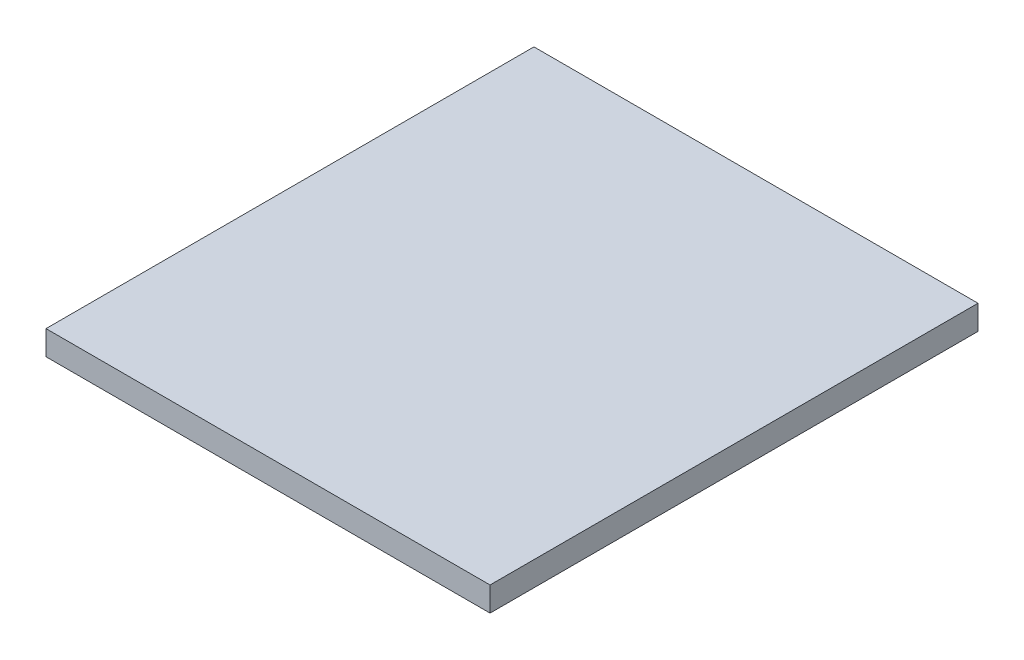
ISO-10303-21;
HEADER;
FILE_DESCRIPTION(('STEP AP214'),'2;1');
FILE_NAME('part.step','',(''),(''),'','','');
FILE_SCHEMA(('AUTOMOTIVE_DESIGN { 1 0 10303 214 1 1 1 1 }'));
ENDSEC;
DATA;
#1=APPLICATION_CONTEXT('core data for automotive mechanical design processes');
#2=APPLICATION_PROTOCOL_DEFINITION('international standard','automotive_design',2000,#1);
#3=PRODUCT_CONTEXT('',#1,'mechanical');
#4=PRODUCT('Part','Part','',(#3));
#5=PRODUCT_RELATED_PRODUCT_CATEGORY('part','',(#4));
#6=PRODUCT_DEFINITION_FORMATION('','',#4);
#7=PRODUCT_DEFINITION_CONTEXT('part definition',#1,'design');
#8=PRODUCT_DEFINITION('design','',#6,#7);
#9=PRODUCT_DEFINITION_SHAPE('','',#8);
#10=(LENGTH_UNIT() NAMED_UNIT(*) SI_UNIT(.MILLI.,.METRE.));
#11=(NAMED_UNIT(*) PLANE_ANGLE_UNIT() SI_UNIT($,.RADIAN.));
#12=(NAMED_UNIT(*) SI_UNIT($,.STERADIAN.) SOLID_ANGLE_UNIT());
#13=UNCERTAINTY_MEASURE_WITH_UNIT(LENGTH_MEASURE(1.E-05),#10,'distance_accuracy_value','');
#14=(GEOMETRIC_REPRESENTATION_CONTEXT(3) GLOBAL_UNCERTAINTY_ASSIGNED_CONTEXT((#13)) GLOBAL_UNIT_ASSIGNED_CONTEXT((#10,
#11,#12)) REPRESENTATION_CONTEXT('',''));
#15=CARTESIAN_POINT('',(0.,0.,0.));
#16=DIRECTION('',(0.,0.,1.));
#17=DIRECTION('',(1.,0.,0.));
#18=AXIS2_PLACEMENT_3D('',#15,#16,#17);
#19=CARTESIAN_POINT('',(-45.5,5.,-50.));
#20=DIRECTION('',(1.,0.,0.));
#21=DIRECTION('',(0.,0.,-1.));
#22=AXIS2_PLACEMENT_3D('',#19,#20,#21);
#23=PLANE('',#22);
#24=DIRECTION('',(0.,0.,1.));
#25=VECTOR('',#24,1.);
#26=CARTESIAN_POINT('',(-45.5,0.,-50.));
#27=LINE('',#26,#25);
#28=CARTESIAN_POINT('',(-45.5,0.,-50.));
#29=VERTEX_POINT('',#28);
#30=CARTESIAN_POINT('',(-45.5,0.,50.));
#31=VERTEX_POINT('',#30);
#32=EDGE_CURVE('E102',#29,#31,#27,.T.);
#33=ORIENTED_EDGE('',*,*,#32,.T.);
#34=DIRECTION('',(0.,-1.,0.));
#35=VECTOR('',#34,1.);
#36=CARTESIAN_POINT('',(-45.5,5.,50.));
#37=LINE('',#36,#35);
#38=CARTESIAN_POINT('',(-45.5,5.,50.));
#39=VERTEX_POINT('',#38);
#40=EDGE_CURVE('E11',#39,#31,#37,.T.);
#41=ORIENTED_EDGE('',*,*,#40,.F.);
#42=DIRECTION('',(0.,0.,1.));
#43=VECTOR('',#42,1.);
#44=CARTESIAN_POINT('',(-45.5,5.,-50.));
#45=LINE('',#44,#43);
#46=CARTESIAN_POINT('',(-45.5,5.,-50.));
#47=VERTEX_POINT('',#46);
#48=EDGE_CURVE('E90',#47,#39,#45,.T.);
#49=ORIENTED_EDGE('',*,*,#48,.F.);
#50=DIRECTION('',(0.,-1.,0.));
#51=VECTOR('',#50,1.);
#52=CARTESIAN_POINT('',(-45.5,5.,-50.));
#53=LINE('',#52,#51);
#54=EDGE_CURVE('E98',#47,#29,#53,.T.);
#55=ORIENTED_EDGE('',*,*,#54,.T.);
#56=EDGE_LOOP('',(#33,#41,#49,#55));
#57=FACE_BOUND('',#56,.T.);
#58=ADVANCED_FACE('F39',(#57),#23,.F.);
#59=CARTESIAN_POINT('',(45.5,5.,50.));
#60=DIRECTION('',(0.,0.,-1.));
#61=DIRECTION('',(-1.,0.,0.));
#62=AXIS2_PLACEMENT_3D('',#59,#60,#61);
#63=PLANE('',#62);
#64=DIRECTION('',(1.,0.,0.));
#65=VECTOR('',#64,1.);
#66=CARTESIAN_POINT('',(45.5,0.,50.));
#67=LINE('',#66,#65);
#68=CARTESIAN_POINT('',(45.5,0.,50.));
#69=VERTEX_POINT('',#68);
#70=EDGE_CURVE('E94',#31,#69,#67,.T.);
#71=ORIENTED_EDGE('',*,*,#70,.T.);
#72=DIRECTION('',(0.,-1.,0.));
#73=VECTOR('',#72,1.);
#74=CARTESIAN_POINT('',(45.5,5.,50.));
#75=LINE('',#74,#73);
#76=CARTESIAN_POINT('',(45.5,5.,50.));
#77=VERTEX_POINT('',#76);
#78=EDGE_CURVE('E47',#77,#69,#75,.T.);
#79=ORIENTED_EDGE('',*,*,#78,.F.);
#80=DIRECTION('',(1.,0.,0.));
#81=VECTOR('',#80,1.);
#82=CARTESIAN_POINT('',(45.5,5.,50.));
#83=LINE('',#82,#81);
#84=EDGE_CURVE('E85',#39,#77,#83,.T.);
#85=ORIENTED_EDGE('',*,*,#84,.F.);
#86=ORIENTED_EDGE('',*,*,#40,.T.);
#87=EDGE_LOOP('',(#71,#79,#85,#86));
#88=FACE_BOUND('',#87,.T.);
#89=ADVANCED_FACE('F93',(#88),#63,.F.);
#90=CARTESIAN_POINT('',(45.5,5.,-50.));
#91=DIRECTION('',(-1.,0.,0.));
#92=DIRECTION('',(0.,0.,1.));
#93=AXIS2_PLACEMENT_3D('',#90,#91,#92);
#94=PLANE('',#93);
#95=DIRECTION('',(0.,0.,-1.));
#96=VECTOR('',#95,1.);
#97=CARTESIAN_POINT('',(45.5,0.,-50.));
#98=LINE('',#97,#96);
#99=CARTESIAN_POINT('',(45.5,0.,-50.));
#100=VERTEX_POINT('',#99);
#101=EDGE_CURVE('E72',#69,#100,#98,.T.);
#102=ORIENTED_EDGE('',*,*,#101,.T.);
#103=DIRECTION('',(0.,-1.,0.));
#104=VECTOR('',#103,1.);
#105=CARTESIAN_POINT('',(45.5,5.,-50.));
#106=LINE('',#105,#104);
#107=CARTESIAN_POINT('',(45.5,5.,-50.));
#108=VERTEX_POINT('',#107);
#109=EDGE_CURVE('E95',#108,#100,#106,.T.);
#110=ORIENTED_EDGE('',*,*,#109,.F.);
#111=DIRECTION('',(0.,0.,-1.));
#112=VECTOR('',#111,1.);
#113=CARTESIAN_POINT('',(45.5,5.,-50.));
#114=LINE('',#113,#112);
#115=EDGE_CURVE('E88',#77,#108,#114,.T.);
#116=ORIENTED_EDGE('',*,*,#115,.F.);
#117=ORIENTED_EDGE('',*,*,#78,.T.);
#118=EDGE_LOOP('',(#102,#110,#116,#117));
#119=FACE_BOUND('',#118,.T.);
#120=ADVANCED_FACE('F96',(#119),#94,.F.);
#121=CARTESIAN_POINT('',(45.5,5.,-50.));
#122=DIRECTION('',(0.,0.,1.));
#123=DIRECTION('',(1.,0.,0.));
#124=AXIS2_PLACEMENT_3D('',#121,#122,#123);
#125=PLANE('',#124);
#126=DIRECTION('',(-1.,0.,0.));
#127=VECTOR('',#126,1.);
#128=CARTESIAN_POINT('',(45.5,0.,-50.));
#129=LINE('',#128,#127);
#130=EDGE_CURVE('E78',#100,#29,#129,.T.);
#131=ORIENTED_EDGE('',*,*,#130,.T.);
#132=ORIENTED_EDGE('',*,*,#54,.F.);
#133=DIRECTION('',(-1.,0.,0.));
#134=VECTOR('',#133,1.);
#135=CARTESIAN_POINT('',(45.5,5.,-50.));
#136=LINE('',#135,#134);
#137=EDGE_CURVE('E55',#108,#47,#136,.T.);
#138=ORIENTED_EDGE('',*,*,#137,.F.);
#139=ORIENTED_EDGE('',*,*,#109,.T.);
#140=EDGE_LOOP('',(#131,#132,#138,#139));
#141=FACE_BOUND('',#140,.T.);
#142=ADVANCED_FACE('F109',(#141),#125,.F.);
#143=CARTESIAN_POINT('',(0.,5.,0.));
#144=DIRECTION('',(0.,-1.,0.));
#145=DIRECTION('',(0.,0.,-1.));
#146=AXIS2_PLACEMENT_3D('',#143,#144,#145);
#147=PLANE('',#146);
#148=ORIENTED_EDGE('',*,*,#48,.T.);
#149=ORIENTED_EDGE('',*,*,#84,.T.);
#150=ORIENTED_EDGE('',*,*,#115,.T.);
#151=ORIENTED_EDGE('',*,*,#137,.T.);
#152=EDGE_LOOP('',(#148,#149,#150,#151));
#153=FACE_BOUND('',#152,.T.);
#154=ADVANCED_FACE('F86',(#153),#147,.F.);
#155=CARTESIAN_POINT('',(0.,0.,0.));
#156=DIRECTION('',(0.,-1.,0.));
#157=DIRECTION('',(0.,0.,-1.));
#158=AXIS2_PLACEMENT_3D('',#155,#156,#157);
#159=PLANE('',#158);
#160=ORIENTED_EDGE('',*,*,#32,.F.);
#161=ORIENTED_EDGE('',*,*,#130,.F.);
#162=ORIENTED_EDGE('',*,*,#101,.F.);
#163=ORIENTED_EDGE('',*,*,#70,.F.);
#164=EDGE_LOOP('',(#160,#161,#162,#163));
#165=FACE_BOUND('',#164,.T.);
#166=ADVANCED_FACE('F112',(#165),#159,.T.);
#167=CLOSED_SHELL('',(#58,#89,#120,#142,#154,#166));
#168=MANIFOLD_SOLID_BREP('B2',#167);
#169=ADVANCED_BREP_SHAPE_REPRESENTATION('',(#18,#168),#14);
#170=SHAPE_DEFINITION_REPRESENTATION(#9,#169);
ENDSEC;
END-ISO-10303-21;
